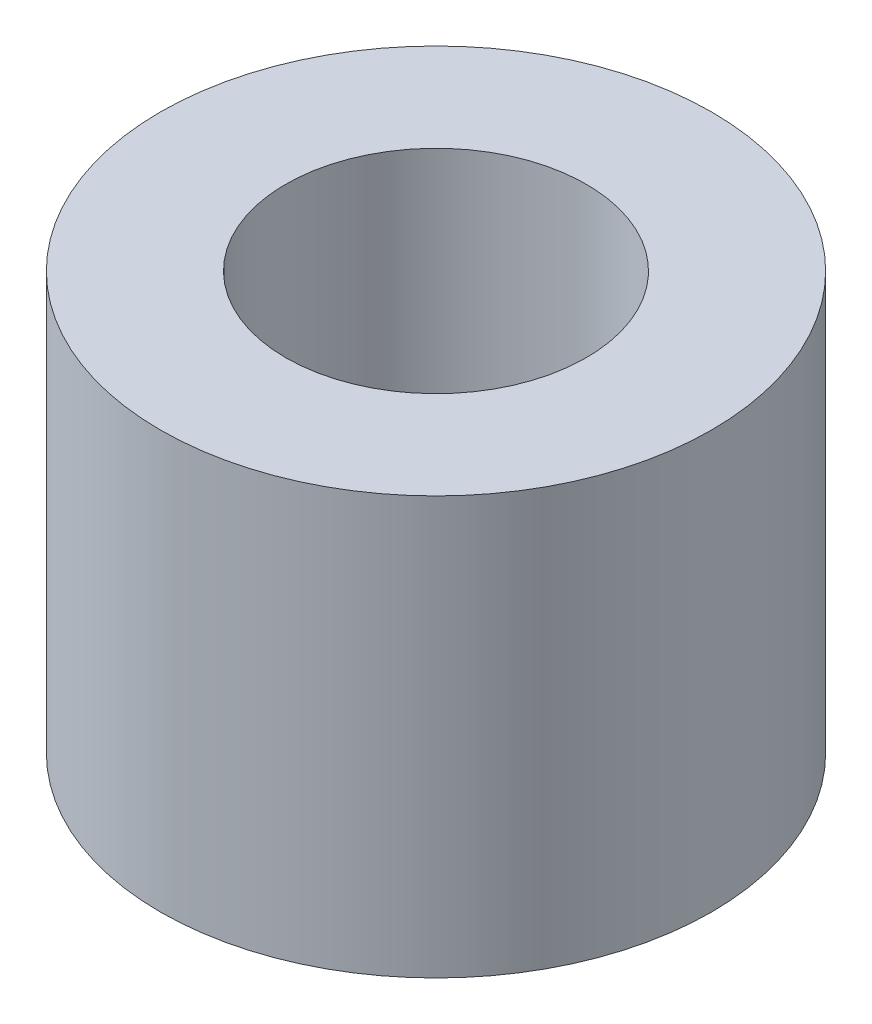
ISO-10303-21;
HEADER;
FILE_DESCRIPTION(('STEP AP214'),'2;1');
FILE_NAME('part.step','',(''),(''),'','','');
FILE_SCHEMA(('AUTOMOTIVE_DESIGN { 1 0 10303 214 1 1 1 1 }'));
ENDSEC;
DATA;
#1=APPLICATION_CONTEXT('core data for automotive mechanical design processes');
#2=APPLICATION_PROTOCOL_DEFINITION('international standard','automotive_design',2000,#1);
#3=PRODUCT_CONTEXT('',#1,'mechanical');
#4=PRODUCT('Part','Part','',(#3));
#5=PRODUCT_RELATED_PRODUCT_CATEGORY('part','',(#4));
#6=PRODUCT_DEFINITION_FORMATION('','',#4);
#7=PRODUCT_DEFINITION_CONTEXT('part definition',#1,'design');
#8=PRODUCT_DEFINITION('design','',#6,#7);
#9=PRODUCT_DEFINITION_SHAPE('','',#8);
#10=(LENGTH_UNIT() NAMED_UNIT(*) SI_UNIT(.MILLI.,.METRE.));
#11=(NAMED_UNIT(*) PLANE_ANGLE_UNIT() SI_UNIT($,.RADIAN.));
#12=(NAMED_UNIT(*) SI_UNIT($,.STERADIAN.) SOLID_ANGLE_UNIT());
#13=UNCERTAINTY_MEASURE_WITH_UNIT(LENGTH_MEASURE(1.E-05),#10,'distance_accuracy_value','');
#14=(GEOMETRIC_REPRESENTATION_CONTEXT(3) GLOBAL_UNCERTAINTY_ASSIGNED_CONTEXT((#13)) GLOBAL_UNIT_ASSIGNED_CONTEXT((#10,
#11,#12)) REPRESENTATION_CONTEXT('',''));
#15=CARTESIAN_POINT('',(0.,0.,0.));
#16=DIRECTION('',(0.,0.,1.));
#17=DIRECTION('',(1.,0.,0.));
#18=AXIS2_PLACEMENT_3D('',#15,#16,#17);
#19=CARTESIAN_POINT('',(0.,5.,0.));
#20=DIRECTION('',(0.,1.,0.));
#21=DIRECTION('',(0.,0.,1.));
#22=AXIS2_PLACEMENT_3D('',#19,#20,#21);
#23=PLANE('',#22);
#24=CARTESIAN_POINT('',(0.,5.,0.));
#25=DIRECTION('',(0.,1.,0.));
#26=DIRECTION('',(0.,0.,1.));
#27=AXIS2_PLACEMENT_3D('',#24,#25,#26);
#28=CIRCLE('',#27,3.3);
#29=CARTESIAN_POINT('',(0.,5.,3.3));
#30=VERTEX_POINT('',#29);
#31=EDGE_CURVE('E10',#30,#30,#28,.T.);
#32=ORIENTED_EDGE('',*,*,#31,.T.);
#33=EDGE_LOOP('',(#32));
#34=FACE_BOUND('',#33,.T.);
#35=CARTESIAN_POINT('',(0.,5.,0.));
#36=DIRECTION('',(0.,1.,0.));
#37=DIRECTION('',(0.,0.,1.));
#38=AXIS2_PLACEMENT_3D('',#35,#36,#37);
#39=CIRCLE('',#38,1.8);
#40=CARTESIAN_POINT('',(0.,5.,1.8));
#41=VERTEX_POINT('',#40);
#42=EDGE_CURVE('E42',#41,#41,#39,.T.);
#43=ORIENTED_EDGE('',*,*,#42,.F.);
#44=EDGE_LOOP('',(#43));
#45=FACE_BOUND('',#44,.T.);
#46=ADVANCED_FACE('F31',(#34,#45),#23,.T.);
#47=CARTESIAN_POINT('',(0.,0.,0.));
#48=DIRECTION('',(0.,1.,0.));
#49=DIRECTION('',(0.,0.,1.));
#50=AXIS2_PLACEMENT_3D('',#47,#48,#49);
#51=PLANE('',#50);
#52=CARTESIAN_POINT('',(0.,0.,0.));
#53=DIRECTION('',(0.,1.,0.));
#54=DIRECTION('',(0.,0.,1.));
#55=AXIS2_PLACEMENT_3D('',#52,#53,#54);
#56=CIRCLE('',#55,3.3);
#57=CARTESIAN_POINT('',(0.,0.,3.3));
#58=VERTEX_POINT('',#57);
#59=EDGE_CURVE('E35',#58,#58,#56,.T.);
#60=ORIENTED_EDGE('',*,*,#59,.F.);
#61=EDGE_LOOP('',(#60));
#62=FACE_BOUND('',#61,.T.);
#63=CARTESIAN_POINT('',(0.,0.,0.));
#64=DIRECTION('',(0.,1.,0.));
#65=DIRECTION('',(0.,0.,1.));
#66=AXIS2_PLACEMENT_3D('',#63,#64,#65);
#67=CIRCLE('',#66,1.8);
#68=CARTESIAN_POINT('',(0.,0.,1.8));
#69=VERTEX_POINT('',#68);
#70=EDGE_CURVE('E44',#69,#69,#67,.T.);
#71=ORIENTED_EDGE('',*,*,#70,.T.);
#72=EDGE_LOOP('',(#71));
#73=FACE_BOUND('',#72,.T.);
#74=ADVANCED_FACE('F54',(#62,#73),#51,.F.);
#75=CARTESIAN_POINT('',(0.,5.,0.));
#76=DIRECTION('',(0.,-1.,0.));
#77=DIRECTION('',(0.,0.,-1.));
#78=AXIS2_PLACEMENT_3D('',#75,#76,#77);
#79=CYLINDRICAL_SURFACE('',#78,3.3);
#80=ORIENTED_EDGE('',*,*,#31,.F.);
#81=EDGE_LOOP('',(#80));
#82=FACE_BOUND('',#81,.T.);
#83=ORIENTED_EDGE('',*,*,#59,.T.);
#84=EDGE_LOOP('',(#83));
#85=FACE_BOUND('',#84,.T.);
#86=ADVANCED_FACE('F33',(#82,#85),#79,.T.);
#87=CARTESIAN_POINT('',(0.,5.,0.));
#88=DIRECTION('',(0.,-1.,0.));
#89=DIRECTION('',(0.,0.,-1.));
#90=AXIS2_PLACEMENT_3D('',#87,#88,#89);
#91=CYLINDRICAL_SURFACE('',#90,1.8);
#92=ORIENTED_EDGE('',*,*,#42,.T.);
#93=EDGE_LOOP('',(#92));
#94=FACE_BOUND('',#93,.T.);
#95=ORIENTED_EDGE('',*,*,#70,.F.);
#96=EDGE_LOOP('',(#95));
#97=FACE_BOUND('',#96,.T.);
#98=ADVANCED_FACE('F50',(#94,#97),#91,.F.);
#99=CLOSED_SHELL('',(#46,#74,#86,#98));
#100=MANIFOLD_SOLID_BREP('B2',#99);
#101=ADVANCED_BREP_SHAPE_REPRESENTATION('',(#18,#100),#14);
#102=SHAPE_DEFINITION_REPRESENTATION(#9,#101);
ENDSEC;
END-ISO-10303-21;
